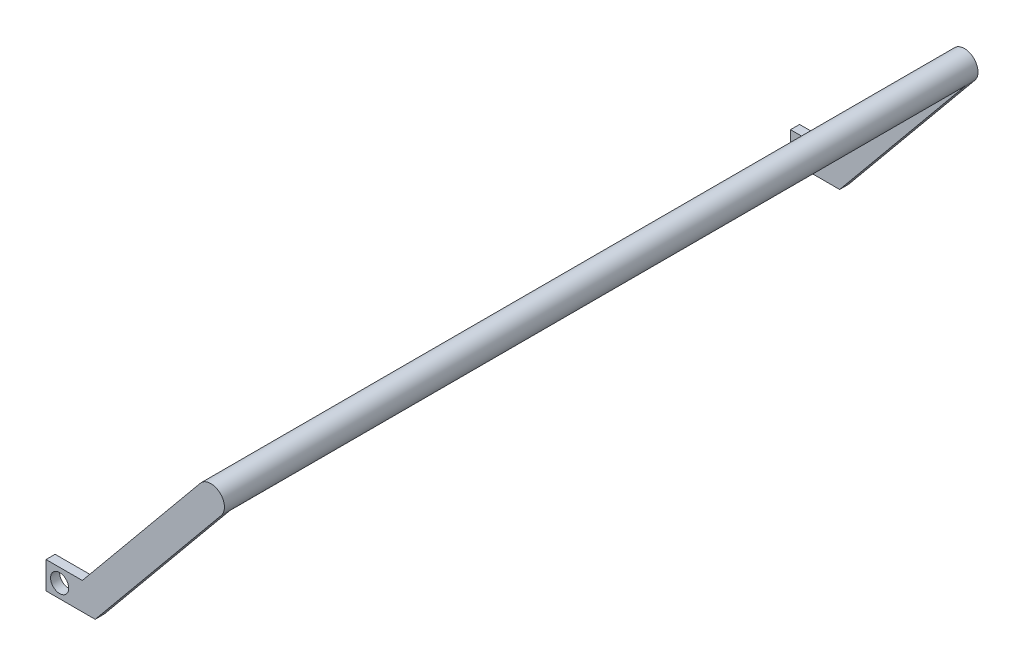
ISO-10303-21;
HEADER;
FILE_DESCRIPTION(('STEP AP214'),'2;1');
FILE_NAME('part.step','',(''),(''),'','','');
FILE_SCHEMA(('AUTOMOTIVE_DESIGN { 1 0 10303 214 1 1 1 1 }'));
ENDSEC;
DATA;
#1=APPLICATION_CONTEXT('core data for automotive mechanical design processes');
#2=APPLICATION_PROTOCOL_DEFINITION('international standard','automotive_design',2000,#1);
#3=PRODUCT_CONTEXT('',#1,'mechanical');
#4=PRODUCT('Part','Part','',(#3));
#5=PRODUCT_RELATED_PRODUCT_CATEGORY('part','',(#4));
#6=PRODUCT_DEFINITION_FORMATION('','',#4);
#7=PRODUCT_DEFINITION_CONTEXT('part definition',#1,'design');
#8=PRODUCT_DEFINITION('design','',#6,#7);
#9=PRODUCT_DEFINITION_SHAPE('','',#8);
#10=(LENGTH_UNIT() NAMED_UNIT(*) SI_UNIT(.MILLI.,.METRE.));
#11=(NAMED_UNIT(*) PLANE_ANGLE_UNIT() SI_UNIT($,.RADIAN.));
#12=(NAMED_UNIT(*) SI_UNIT($,.STERADIAN.) SOLID_ANGLE_UNIT());
#13=UNCERTAINTY_MEASURE_WITH_UNIT(LENGTH_MEASURE(1.E-05),#10,'distance_accuracy_value','');
#14=(GEOMETRIC_REPRESENTATION_CONTEXT(3) GLOBAL_UNCERTAINTY_ASSIGNED_CONTEXT((#13)) GLOBAL_UNIT_ASSIGNED_CONTEXT((#10,
#11,#12)) REPRESENTATION_CONTEXT('',''));
#15=CARTESIAN_POINT('',(0.,0.,0.));
#16=DIRECTION('',(0.,0.,1.));
#17=DIRECTION('',(1.,0.,0.));
#18=AXIS2_PLACEMENT_3D('',#15,#16,#17);
#19=CARTESIAN_POINT('',(0.,0.,-5.));
#20=DIRECTION('',(-1.,0.,0.));
#21=DIRECTION('',(0.,-1.,0.));
#22=AXIS2_PLACEMENT_3D('',#19,#20,#21);
#23=PLANE('',#22);
#24=DIRECTION('',(0.,-1.,0.));
#25=VECTOR('',#24,1.);
#26=CARTESIAN_POINT('',(0.,0.,0.));
#27=LINE('',#26,#25);
#28=CARTESIAN_POINT('',(0.,0.,0.));
#29=VERTEX_POINT('',#28);
#30=CARTESIAN_POINT('',(0.,-15.,0.));
#31=VERTEX_POINT('',#30);
#32=EDGE_CURVE('E118',#29,#31,#27,.T.);
#33=ORIENTED_EDGE('',*,*,#32,.F.);
#34=DIRECTION('',(0.,0.,1.));
#35=VECTOR('',#34,1.);
#36=CARTESIAN_POINT('',(0.,0.,-5.));
#37=LINE('',#36,#35);
#38=CARTESIAN_POINT('',(0.,0.,-5.));
#39=VERTEX_POINT('',#38);
#40=EDGE_CURVE('E11',#39,#29,#37,.T.);
#41=ORIENTED_EDGE('',*,*,#40,.F.);
#42=DIRECTION('',(0.,-1.,0.));
#43=VECTOR('',#42,1.);
#44=CARTESIAN_POINT('',(0.,0.,-5.));
#45=LINE('',#44,#43);
#46=CARTESIAN_POINT('',(0.,-15.,-5.));
#47=VERTEX_POINT('',#46);
#48=EDGE_CURVE('E125',#39,#47,#45,.T.);
#49=ORIENTED_EDGE('',*,*,#48,.T.);
#50=DIRECTION('',(0.,0.,1.));
#51=VECTOR('',#50,1.);
#52=CARTESIAN_POINT('',(0.,-15.,-5.));
#53=LINE('',#52,#51);
#54=EDGE_CURVE('E83',#47,#31,#53,.T.);
#55=ORIENTED_EDGE('',*,*,#54,.T.);
#56=EDGE_LOOP('',(#33,#41,#49,#55));
#57=FACE_BOUND('',#56,.T.);
#58=ADVANCED_FACE('F33',(#57),#23,.T.);
#59=CARTESIAN_POINT('',(0.,0.,-5.));
#60=DIRECTION('',(0.,1.,0.));
#61=DIRECTION('',(0.,0.,1.));
#62=AXIS2_PLACEMENT_3D('',#59,#60,#61);
#63=PLANE('',#62);
#64=DIRECTION('',(-1.,0.,0.));
#65=VECTOR('',#64,1.);
#66=CARTESIAN_POINT('',(0.,0.,0.));
#67=LINE('',#66,#65);
#68=CARTESIAN_POINT('',(20.,0.,0.));
#69=VERTEX_POINT('',#68);
#70=EDGE_CURVE('E140',#69,#29,#67,.T.);
#71=ORIENTED_EDGE('',*,*,#70,.F.);
#72=DIRECTION('',(0.,0.,1.));
#73=VECTOR('',#72,1.);
#74=CARTESIAN_POINT('',(20.,0.,-5.));
#75=LINE('',#74,#73);
#76=CARTESIAN_POINT('',(20.,0.,-5.));
#77=VERTEX_POINT('',#76);
#78=EDGE_CURVE('E41',#77,#69,#75,.T.);
#79=ORIENTED_EDGE('',*,*,#78,.F.);
#80=DIRECTION('',(-1.,0.,0.));
#81=VECTOR('',#80,1.);
#82=CARTESIAN_POINT('',(0.,0.,-5.));
#83=LINE('',#82,#81);
#84=EDGE_CURVE('E123',#77,#39,#83,.T.);
#85=ORIENTED_EDGE('',*,*,#84,.T.);
#86=ORIENTED_EDGE('',*,*,#40,.T.);
#87=EDGE_LOOP('',(#71,#79,#85,#86));
#88=FACE_BOUND('',#87,.T.);
#89=ADVANCED_FACE('F149',(#88),#63,.T.);
#90=CARTESIAN_POINT('',(20.,0.,-5.));
#91=DIRECTION('',(-0.771758163826311,0.635916139571438,0.));
#92=DIRECTION('',(-0.635916139571438,-0.771758163826312,0.));
#93=AXIS2_PLACEMENT_3D('',#90,#91,#92);
#94=PLANE('',#93);
#95=DIRECTION('',(-0.635916139571438,-0.771758163826311,0.));
#96=VECTOR('',#95,1.);
#97=CARTESIAN_POINT('',(20.,0.,0.));
#98=LINE('',#97,#96);
#99=CARTESIAN_POINT('',(84.9863142874151,78.8684473743584,0.));
#100=VERTEX_POINT('',#99);
#101=EDGE_CURVE('E137',#100,#69,#98,.T.);
#102=ORIENTED_EDGE('',*,*,#101,.F.);
#103=DIRECTION('',(0.,0.,1.));
#104=VECTOR('',#103,1.);
#105=CARTESIAN_POINT('',(84.9863142874151,78.8684473743584,-5.));
#106=LINE('',#105,#104);
#107=CARTESIAN_POINT('',(84.9863142874151,78.8684473743584,-5.));
#108=VERTEX_POINT('',#107);
#109=EDGE_CURVE('E107',#108,#100,#106,.T.);
#110=ORIENTED_EDGE('',*,*,#109,.F.);
#111=DIRECTION('',(-0.635916139571438,-0.771758163826311,0.));
#112=VECTOR('',#111,1.);
#113=CARTESIAN_POINT('',(20.,0.,-5.));
#114=LINE('',#113,#112);
#115=EDGE_CURVE('E117',#108,#77,#114,.T.);
#116=ORIENTED_EDGE('',*,*,#115,.T.);
#117=ORIENTED_EDGE('',*,*,#78,.T.);
#118=EDGE_LOOP('',(#102,#110,#116,#117));
#119=FACE_BOUND('',#118,.T.);
#120=ADVANCED_FACE('F151',(#119),#94,.T.);
#121=CARTESIAN_POINT('',(27.0763850159381,-15.,-5.));
#122=DIRECTION('',(0.771758163826311,-0.635916139571438,0.));
#123=DIRECTION('',(0.635916139571438,0.771758163826311,0.));
#124=AXIS2_PLACEMENT_3D('',#121,#122,#123);
#125=PLANE('',#124);
#126=DIRECTION('',(0.635916139571438,0.771758163826311,0.));
#127=VECTOR('',#126,1.);
#128=CARTESIAN_POINT('',(27.0763850159381,-15.,0.));
#129=LINE('',#128,#127);
#130=CARTESIAN_POINT('',(27.0763850159381,-15.,0.));
#131=VERTEX_POINT('',#130);
#132=CARTESIAN_POINT('',(96.5626867448098,69.3297052807868,0.));
#133=VERTEX_POINT('',#132);
#134=EDGE_CURVE('E135',#131,#133,#129,.T.);
#135=ORIENTED_EDGE('',*,*,#134,.F.);
#136=DIRECTION('',(0.,0.,1.));
#137=VECTOR('',#136,1.);
#138=CARTESIAN_POINT('',(27.0763850159381,-15.,-5.));
#139=LINE('',#138,#137);
#140=CARTESIAN_POINT('',(27.0763850159381,-15.,-5.));
#141=VERTEX_POINT('',#140);
#142=EDGE_CURVE('E108',#141,#131,#139,.T.);
#143=ORIENTED_EDGE('',*,*,#142,.F.);
#144=DIRECTION('',(0.635916139571438,0.771758163826311,0.));
#145=VECTOR('',#144,1.);
#146=CARTESIAN_POINT('',(27.0763850159381,-15.,-5.));
#147=LINE('',#146,#145);
#148=CARTESIAN_POINT('',(96.5626867448098,69.3297052807868,-5.));
#149=VERTEX_POINT('',#148);
#150=EDGE_CURVE('E114',#141,#149,#147,.T.);
#151=ORIENTED_EDGE('',*,*,#150,.T.);
#152=DIRECTION('',(0.,0.,1.));
#153=VECTOR('',#152,1.);
#154=CARTESIAN_POINT('',(96.5626867448098,69.3297052807868,-5.));
#155=LINE('',#154,#153);
#156=EDGE_CURVE('E94',#149,#133,#155,.T.);
#157=ORIENTED_EDGE('',*,*,#156,.T.);
#158=EDGE_LOOP('',(#135,#143,#151,#157));
#159=FACE_BOUND('',#158,.T.);
#160=ADVANCED_FACE('F120',(#159),#125,.T.);
#161=CARTESIAN_POINT('',(0.,-15.,-5.));
#162=DIRECTION('',(0.,-1.,0.));
#163=DIRECTION('',(1.,0.,0.));
#164=AXIS2_PLACEMENT_3D('',#161,#162,#163);
#165=PLANE('',#164);
#166=DIRECTION('',(1.,0.,0.));
#167=VECTOR('',#166,1.);
#168=CARTESIAN_POINT('',(0.,-15.,0.));
#169=LINE('',#168,#167);
#170=EDGE_CURVE('E132',#31,#131,#169,.T.);
#171=ORIENTED_EDGE('',*,*,#170,.F.);
#172=ORIENTED_EDGE('',*,*,#54,.F.);
#173=DIRECTION('',(1.,0.,0.));
#174=VECTOR('',#173,1.);
#175=CARTESIAN_POINT('',(0.,-15.,-5.));
#176=LINE('',#175,#174);
#177=EDGE_CURVE('E121',#47,#141,#176,.T.);
#178=ORIENTED_EDGE('',*,*,#177,.T.);
#179=ORIENTED_EDGE('',*,*,#142,.T.);
#180=EDGE_LOOP('',(#171,#172,#178,#179));
#181=FACE_BOUND('',#180,.T.);
#182=ADVANCED_FACE('F145',(#181),#165,.T.);
#183=CARTESIAN_POINT('',(0.,0.,-5.));
#184=DIRECTION('',(0.,0.,1.));
#185=DIRECTION('',(1.,0.,0.));
#186=AXIS2_PLACEMENT_3D('',#183,#184,#185);
#187=PLANE('',#186);
#188=CARTESIAN_POINT('',(7.5,-7.5,-5.));
#189=DIRECTION('',(0.,0.,1.));
#190=DIRECTION('',(1.,0.,0.));
#191=AXIS2_PLACEMENT_3D('',#188,#189,#190);
#192=CIRCLE('',#191,5.);
#193=CARTESIAN_POINT('',(12.5,-7.5,-5.));
#194=VERTEX_POINT('',#193);
#195=EDGE_CURVE('E192',#194,#194,#192,.T.);
#196=ORIENTED_EDGE('',*,*,#195,.T.);
#197=EDGE_LOOP('',(#196));
#198=FACE_BOUND('',#197,.T.);
#199=ORIENTED_EDGE('',*,*,#115,.F.);
#200=CARTESIAN_POINT('',(90.7745005161124,74.0990763275726,-5.));
#201=DIRECTION('',(0.,0.,1.));
#202=DIRECTION('',(1.,0.,0.));
#203=AXIS2_PLACEMENT_3D('',#200,#201,#202);
#204=CIRCLE('',#203,7.50000000000001);
#205=EDGE_CURVE('E98',#108,#149,#204,.T.);
#206=ORIENTED_EDGE('',*,*,#205,.T.);
#207=ORIENTED_EDGE('',*,*,#150,.F.);
#208=ORIENTED_EDGE('',*,*,#177,.F.);
#209=ORIENTED_EDGE('',*,*,#48,.F.);
#210=ORIENTED_EDGE('',*,*,#84,.F.);
#211=EDGE_LOOP('',(#199,#206,#207,#208,#209,#210));
#212=FACE_BOUND('',#211,.T.);
#213=ADVANCED_FACE('F113',(#198,#212),#187,.F.);
#214=CARTESIAN_POINT('',(0.,0.,0.));
#215=DIRECTION('',(0.,0.,1.));
#216=DIRECTION('',(1.,0.,0.));
#217=AXIS2_PLACEMENT_3D('',#214,#215,#216);
#218=PLANE('',#217);
#219=CARTESIAN_POINT('',(7.5,-7.5,0.));
#220=DIRECTION('',(0.,0.,-1.));
#221=DIRECTION('',(-1.,0.,0.));
#222=AXIS2_PLACEMENT_3D('',#219,#220,#221);
#223=CIRCLE('',#222,5.);
#224=CARTESIAN_POINT('',(2.5,-7.5,0.));
#225=VERTEX_POINT('',#224);
#226=EDGE_CURVE('E210',#225,#225,#223,.T.);
#227=ORIENTED_EDGE('',*,*,#226,.T.);
#228=EDGE_LOOP('',(#227));
#229=FACE_BOUND('',#228,.T.);
#230=ORIENTED_EDGE('',*,*,#134,.T.);
#231=CARTESIAN_POINT('',(90.7745005161124,74.0990763275726,0.));
#232=DIRECTION('',(0.,0.,1.));
#233=DIRECTION('',(1.,0.,0.));
#234=AXIS2_PLACEMENT_3D('',#231,#232,#233);
#235=CIRCLE('',#234,7.50000000000001);
#236=EDGE_CURVE('E102',#133,#100,#235,.T.);
#237=ORIENTED_EDGE('',*,*,#236,.T.);
#238=ORIENTED_EDGE('',*,*,#101,.T.);
#239=ORIENTED_EDGE('',*,*,#70,.T.);
#240=ORIENTED_EDGE('',*,*,#32,.T.);
#241=ORIENTED_EDGE('',*,*,#170,.T.);
#242=EDGE_LOOP('',(#230,#237,#238,#239,#240,#241));
#243=FACE_BOUND('',#242,.T.);
#244=ADVANCED_FACE('F147',(#229,#243),#218,.T.);
#245=CARTESIAN_POINT('',(90.7745005161124,74.0990763275726,-410.));
#246=DIRECTION('',(0.,0.,1.));
#247=DIRECTION('',(1.,0.,0.));
#248=AXIS2_PLACEMENT_3D('',#245,#246,#247);
#249=CYLINDRICAL_SURFACE('',#248,7.50000000000001);
#250=DIRECTION('',(0.,0.,1.));
#251=VECTOR('',#250,1.);
#252=CARTESIAN_POINT('',(84.9863142874151,78.8684473743584,-415.));
#253=LINE('',#252,#251);
#254=CARTESIAN_POINT('',(84.9863142874151,78.8684473743584,-415.));
#255=VERTEX_POINT('',#254);
#256=CARTESIAN_POINT('',(84.9863142874151,78.8684473743584,-410.));
#257=VERTEX_POINT('',#256);
#258=EDGE_CURVE('E49',#255,#257,#253,.T.);
#259=ORIENTED_EDGE('',*,*,#258,.T.);
#260=CARTESIAN_POINT('',(90.7745005161124,74.0990763275726,-410.));
#261=DIRECTION('',(0.,0.,1.));
#262=DIRECTION('',(-1.,0.,0.));
#263=AXIS2_PLACEMENT_3D('',#260,#261,#262);
#264=CIRCLE('',#263,7.50000000000001);
#265=CARTESIAN_POINT('',(96.5626867448098,69.3297052807868,-410.));
#266=VERTEX_POINT('',#265);
#267=EDGE_CURVE('E184',#257,#266,#264,.T.);
#268=ORIENTED_EDGE('',*,*,#267,.T.);
#269=DIRECTION('',(0.,0.,1.));
#270=VECTOR('',#269,1.);
#271=CARTESIAN_POINT('',(96.5626867448098,69.3297052807868,-415.));
#272=LINE('',#271,#270);
#273=CARTESIAN_POINT('',(96.5626867448098,69.3297052807868,-415.));
#274=VERTEX_POINT('',#273);
#275=EDGE_CURVE('E161',#274,#266,#272,.T.);
#276=ORIENTED_EDGE('',*,*,#275,.F.);
#277=CARTESIAN_POINT('',(90.7745005161124,74.0990763275726,-415.));
#278=DIRECTION('',(0.,0.,-1.));
#279=DIRECTION('',(-1.,0.,0.));
#280=AXIS2_PLACEMENT_3D('',#277,#278,#279);
#281=CIRCLE('',#280,7.50000000000003);
#282=EDGE_CURVE('E154',#255,#274,#281,.T.);
#283=ORIENTED_EDGE('',*,*,#282,.F.);
#284=EDGE_LOOP('',(#259,#268,#276,#283));
#285=FACE_BOUND('',#284,.T.);
#286=ORIENTED_EDGE('',*,*,#205,.F.);
#287=ORIENTED_EDGE('',*,*,#109,.T.);
#288=ORIENTED_EDGE('',*,*,#236,.F.);
#289=ORIENTED_EDGE('',*,*,#156,.F.);
#290=EDGE_LOOP('',(#286,#287,#288,#289));
#291=FACE_BOUND('',#290,.T.);
#292=ADVANCED_FACE('F96',(#285,#291),#249,.T.);
#293=CARTESIAN_POINT('',(90.7745005161124,74.0990763275726,-415.));
#294=DIRECTION('',(0.,0.,-1.));
#295=DIRECTION('',(-1.,0.,0.));
#296=AXIS2_PLACEMENT_3D('',#293,#294,#295);
#297=PLANE('',#296);
#298=CARTESIAN_POINT('',(7.5,-7.5,-415.));
#299=DIRECTION('',(0.,0.,-1.));
#300=DIRECTION('',(-1.,0.,0.));
#301=AXIS2_PLACEMENT_3D('',#298,#299,#300);
#302=CIRCLE('',#301,5.);
#303=CARTESIAN_POINT('',(2.5,-7.5,-415.));
#304=VERTEX_POINT('',#303);
#305=EDGE_CURVE('E207',#304,#304,#302,.T.);
#306=ORIENTED_EDGE('',*,*,#305,.F.);
#307=EDGE_LOOP('',(#306));
#308=FACE_BOUND('',#307,.T.);
#309=ORIENTED_EDGE('',*,*,#282,.T.);
#310=DIRECTION('',(-0.635916139571438,-0.771758163826311,0.));
#311=VECTOR('',#310,1.);
#312=CARTESIAN_POINT('',(96.5626867448098,69.3297052807868,-415.));
#313=LINE('',#312,#311);
#314=CARTESIAN_POINT('',(27.0763850159381,-15.,-415.));
#315=VERTEX_POINT('',#314);
#316=EDGE_CURVE('E198',#274,#315,#313,.T.);
#317=ORIENTED_EDGE('',*,*,#316,.T.);
#318=DIRECTION('',(-1.,0.,0.));
#319=VECTOR('',#318,1.);
#320=CARTESIAN_POINT('',(27.0763850159381,-15.,-415.));
#321=LINE('',#320,#319);
#322=CARTESIAN_POINT('',(0.,-15.,-415.));
#323=VERTEX_POINT('',#322);
#324=EDGE_CURVE('E195',#315,#323,#321,.T.);
#325=ORIENTED_EDGE('',*,*,#324,.T.);
#326=DIRECTION('',(0.,1.,0.));
#327=VECTOR('',#326,1.);
#328=CARTESIAN_POINT('',(0.,-15.,-415.));
#329=LINE('',#328,#327);
#330=CARTESIAN_POINT('',(0.,0.,-415.));
#331=VERTEX_POINT('',#330);
#332=EDGE_CURVE('E173',#323,#331,#329,.T.);
#333=ORIENTED_EDGE('',*,*,#332,.T.);
#334=DIRECTION('',(1.,0.,0.));
#335=VECTOR('',#334,1.);
#336=CARTESIAN_POINT('',(0.,0.,-415.));
#337=LINE('',#336,#335);
#338=CARTESIAN_POINT('',(20.,0.,-415.));
#339=VERTEX_POINT('',#338);
#340=EDGE_CURVE('E177',#331,#339,#337,.T.);
#341=ORIENTED_EDGE('',*,*,#340,.T.);
#342=DIRECTION('',(0.635916139571438,0.771758163826311,0.));
#343=VECTOR('',#342,1.);
#344=CARTESIAN_POINT('',(20.,0.,-415.));
#345=LINE('',#344,#343);
#346=EDGE_CURVE('E201',#339,#255,#345,.T.);
#347=ORIENTED_EDGE('',*,*,#346,.T.);
#348=EDGE_LOOP('',(#309,#317,#325,#333,#341,#347));
#349=FACE_BOUND('',#348,.T.);
#350=ADVANCED_FACE('F256',(#308,#349),#297,.T.);
#351=CARTESIAN_POINT('',(0.,0.,-415.));
#352=DIRECTION('',(0.,-1.,0.));
#353=DIRECTION('',(0.,0.,-1.));
#354=AXIS2_PLACEMENT_3D('',#351,#352,#353);
#355=PLANE('',#354);
#356=DIRECTION('',(1.,0.,0.));
#357=VECTOR('',#356,1.);
#358=CARTESIAN_POINT('',(0.,0.,-410.));
#359=LINE('',#358,#357);
#360=CARTESIAN_POINT('',(0.,0.,-410.));
#361=VERTEX_POINT('',#360);
#362=CARTESIAN_POINT('',(20.,0.,-410.));
#363=VERTEX_POINT('',#362);
#364=EDGE_CURVE('E189',#361,#363,#359,.T.);
#365=ORIENTED_EDGE('',*,*,#364,.T.);
#366=DIRECTION('',(0.,0.,1.));
#367=VECTOR('',#366,1.);
#368=CARTESIAN_POINT('',(20.,0.,-415.));
#369=LINE('',#368,#367);
#370=EDGE_CURVE('E157',#339,#363,#369,.T.);
#371=ORIENTED_EDGE('',*,*,#370,.F.);
#372=ORIENTED_EDGE('',*,*,#340,.F.);
#373=DIRECTION('',(0.,0.,1.));
#374=VECTOR('',#373,1.);
#375=CARTESIAN_POINT('',(0.,0.,-415.));
#376=LINE('',#375,#374);
#377=EDGE_CURVE('E170',#331,#361,#376,.T.);
#378=ORIENTED_EDGE('',*,*,#377,.T.);
#379=EDGE_LOOP('',(#365,#371,#372,#378));
#380=FACE_BOUND('',#379,.T.);
#381=ADVANCED_FACE('F260',(#380),#355,.F.);
#382=CARTESIAN_POINT('',(20.,0.,-415.));
#383=DIRECTION('',(0.771758163826311,-0.635916139571438,0.));
#384=DIRECTION('',(0.635916139571438,0.771758163826312,0.));
#385=AXIS2_PLACEMENT_3D('',#382,#383,#384);
#386=PLANE('',#385);
#387=DIRECTION('',(0.635916139571438,0.771758163826311,0.));
#388=VECTOR('',#387,1.);
#389=CARTESIAN_POINT('',(20.,0.,-410.));
#390=LINE('',#389,#388);
#391=EDGE_CURVE('E187',#363,#257,#390,.T.);
#392=ORIENTED_EDGE('',*,*,#391,.T.);
#393=ORIENTED_EDGE('',*,*,#258,.F.);
#394=ORIENTED_EDGE('',*,*,#346,.F.);
#395=ORIENTED_EDGE('',*,*,#370,.T.);
#396=EDGE_LOOP('',(#392,#393,#394,#395));
#397=FACE_BOUND('',#396,.T.);
#398=ADVANCED_FACE('F264',(#397),#386,.F.);
#399=CARTESIAN_POINT('',(96.5626867448098,69.3297052807868,-415.));
#400=DIRECTION('',(-0.771758163826311,0.635916139571438,0.));
#401=DIRECTION('',(-0.635916139571438,-0.771758163826311,0.));
#402=AXIS2_PLACEMENT_3D('',#399,#400,#401);
#403=PLANE('',#402);
#404=DIRECTION('',(-0.635916139571438,-0.771758163826311,0.));
#405=VECTOR('',#404,1.);
#406=CARTESIAN_POINT('',(96.5626867448098,69.3297052807868,-410.));
#407=LINE('',#406,#405);
#408=CARTESIAN_POINT('',(27.0763850159381,-15.,-410.));
#409=VERTEX_POINT('',#408);
#410=EDGE_CURVE('E181',#266,#409,#407,.T.);
#411=ORIENTED_EDGE('',*,*,#410,.T.);
#412=DIRECTION('',(0.,0.,1.));
#413=VECTOR('',#412,1.);
#414=CARTESIAN_POINT('',(27.0763850159381,-15.,-415.));
#415=LINE('',#414,#413);
#416=EDGE_CURVE('E164',#315,#409,#415,.T.);
#417=ORIENTED_EDGE('',*,*,#416,.F.);
#418=ORIENTED_EDGE('',*,*,#316,.F.);
#419=ORIENTED_EDGE('',*,*,#275,.T.);
#420=EDGE_LOOP('',(#411,#417,#418,#419));
#421=FACE_BOUND('',#420,.T.);
#422=ADVANCED_FACE('F268',(#421),#403,.F.);
#423=CARTESIAN_POINT('',(27.0763850159381,-15.,-415.));
#424=DIRECTION('',(0.,1.,0.));
#425=DIRECTION('',(-1.,0.,0.));
#426=AXIS2_PLACEMENT_3D('',#423,#424,#425);
#427=PLANE('',#426);
#428=DIRECTION('',(-1.,0.,0.));
#429=VECTOR('',#428,1.);
#430=CARTESIAN_POINT('',(27.0763850159381,-15.,-410.));
#431=LINE('',#430,#429);
#432=CARTESIAN_POINT('',(0.,-15.,-410.));
#433=VERTEX_POINT('',#432);
#434=EDGE_CURVE('E178',#409,#433,#431,.T.);
#435=ORIENTED_EDGE('',*,*,#434,.T.);
#436=DIRECTION('',(0.,0.,1.));
#437=VECTOR('',#436,1.);
#438=CARTESIAN_POINT('',(0.,-15.,-415.));
#439=LINE('',#438,#437);
#440=EDGE_CURVE('E167',#323,#433,#439,.T.);
#441=ORIENTED_EDGE('',*,*,#440,.F.);
#442=ORIENTED_EDGE('',*,*,#324,.F.);
#443=ORIENTED_EDGE('',*,*,#416,.T.);
#444=EDGE_LOOP('',(#435,#441,#442,#443));
#445=FACE_BOUND('',#444,.T.);
#446=ADVANCED_FACE('F271',(#445),#427,.F.);
#447=CARTESIAN_POINT('',(0.,-15.,-415.));
#448=DIRECTION('',(1.,0.,0.));
#449=DIRECTION('',(0.,1.,0.));
#450=AXIS2_PLACEMENT_3D('',#447,#448,#449);
#451=PLANE('',#450);
#452=DIRECTION('',(0.,1.,0.));
#453=VECTOR('',#452,1.);
#454=CARTESIAN_POINT('',(0.,-15.,-410.));
#455=LINE('',#454,#453);
#456=EDGE_CURVE('E174',#433,#361,#455,.T.);
#457=ORIENTED_EDGE('',*,*,#456,.T.);
#458=ORIENTED_EDGE('',*,*,#377,.F.);
#459=ORIENTED_EDGE('',*,*,#332,.F.);
#460=ORIENTED_EDGE('',*,*,#440,.T.);
#461=EDGE_LOOP('',(#457,#458,#459,#460));
#462=FACE_BOUND('',#461,.T.);
#463=ADVANCED_FACE('F230',(#462),#451,.F.);
#464=CARTESIAN_POINT('',(90.7745005161124,74.0990763275726,-410.));
#465=DIRECTION('',(0.,0.,-1.));
#466=DIRECTION('',(-1.,0.,0.));
#467=AXIS2_PLACEMENT_3D('',#464,#465,#466);
#468=PLANE('',#467);
#469=CARTESIAN_POINT('',(7.5,-7.5,-410.));
#470=DIRECTION('',(0.,0.,-1.));
#471=DIRECTION('',(-1.,0.,0.));
#472=AXIS2_PLACEMENT_3D('',#469,#470,#471);
#473=CIRCLE('',#472,5.);
#474=CARTESIAN_POINT('',(2.5,-7.5,-410.));
#475=VERTEX_POINT('',#474);
#476=EDGE_CURVE('E36',#475,#475,#473,.T.);
#477=ORIENTED_EDGE('',*,*,#476,.T.);
#478=EDGE_LOOP('',(#477));
#479=FACE_BOUND('',#478,.T.);
#480=ORIENTED_EDGE('',*,*,#364,.F.);
#481=ORIENTED_EDGE('',*,*,#456,.F.);
#482=ORIENTED_EDGE('',*,*,#434,.F.);
#483=ORIENTED_EDGE('',*,*,#410,.F.);
#484=ORIENTED_EDGE('',*,*,#267,.F.);
#485=ORIENTED_EDGE('',*,*,#391,.F.);
#486=EDGE_LOOP('',(#480,#481,#482,#483,#484,#485));
#487=FACE_BOUND('',#486,.T.);
#488=ADVANCED_FACE('F217',(#479,#487),#468,.F.);
#489=CARTESIAN_POINT('',(7.5,-7.5,0.));
#490=DIRECTION('',(0.,0.,-1.));
#491=DIRECTION('',(-1.,0.,0.));
#492=AXIS2_PLACEMENT_3D('',#489,#490,#491);
#493=CYLINDRICAL_SURFACE('',#492,5.);
#494=ORIENTED_EDGE('',*,*,#305,.T.);
#495=EDGE_LOOP('',(#494));
#496=FACE_BOUND('',#495,.T.);
#497=ORIENTED_EDGE('',*,*,#476,.F.);
#498=EDGE_LOOP('',(#497));
#499=FACE_BOUND('',#498,.T.);
#500=ADVANCED_FACE('F220',(#496,#499),#493,.F.);
#501=ORIENTED_EDGE('',*,*,#226,.F.);
#502=EDGE_LOOP('',(#501));
#503=FACE_BOUND('',#502,.T.);
#504=ORIENTED_EDGE('',*,*,#195,.F.);
#505=EDGE_LOOP('',(#504));
#506=FACE_BOUND('',#505,.T.);
#507=ADVANCED_FACE('F222',(#503,#506),#493,.F.);
#508=CLOSED_SHELL('',(#58,#89,#120,#160,#182,#213,#244,#292,#350,#381,#398,#422,#446,#463,#488,
#500,#507));
#509=MANIFOLD_SOLID_BREP('B2',#508);
#510=ADVANCED_BREP_SHAPE_REPRESENTATION('',(#18,#509),#14);
#511=SHAPE_DEFINITION_REPRESENTATION(#9,#510);
ENDSEC;
END-ISO-10303-21;
